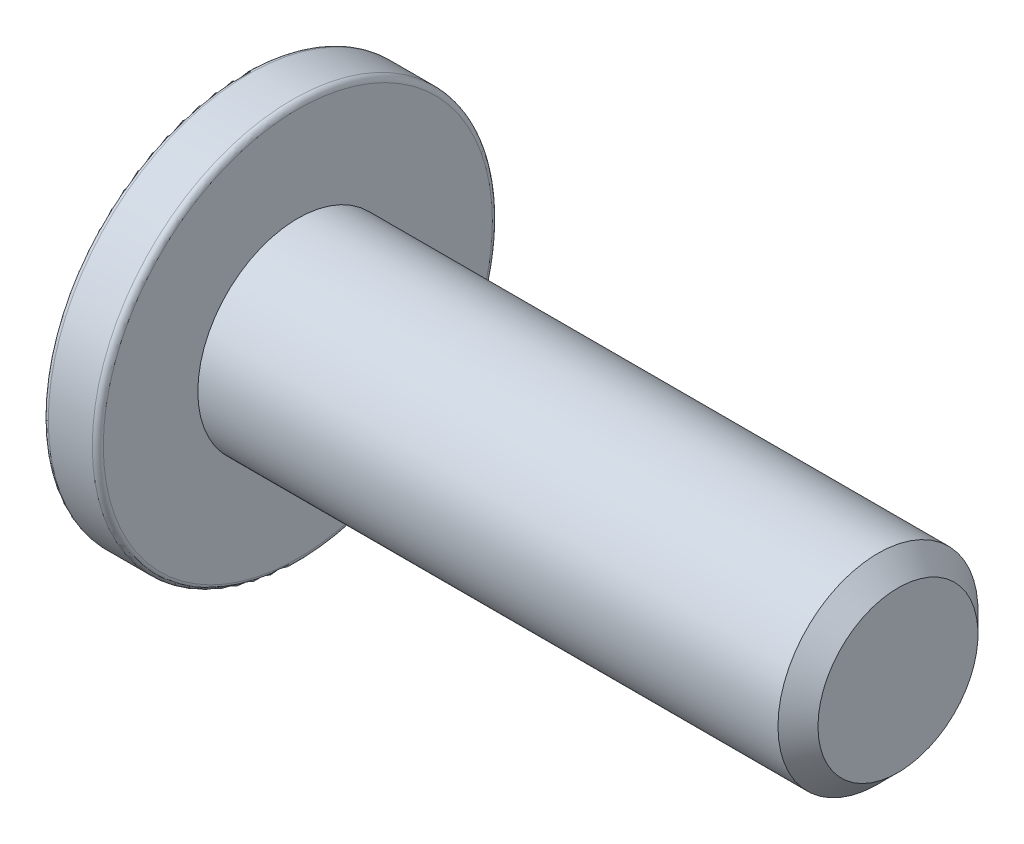
ISO-10303-21;
HEADER;
FILE_DESCRIPTION(('STEP AP214'),'2;1');
FILE_NAME('part.step','',(''),(''),'','','');
FILE_SCHEMA(('AUTOMOTIVE_DESIGN { 1 0 10303 214 1 1 1 1 }'));
ENDSEC;
DATA;
#1=APPLICATION_CONTEXT('core data for automotive mechanical design processes');
#2=APPLICATION_PROTOCOL_DEFINITION('international standard','automotive_design',2000,#1);
#3=PRODUCT_CONTEXT('',#1,'mechanical');
#4=PRODUCT('Part','Part','',(#3));
#5=PRODUCT_RELATED_PRODUCT_CATEGORY('part','',(#4));
#6=PRODUCT_DEFINITION_FORMATION('','',#4);
#7=PRODUCT_DEFINITION_CONTEXT('part definition',#1,'design');
#8=PRODUCT_DEFINITION('design','',#6,#7);
#9=PRODUCT_DEFINITION_SHAPE('','',#8);
#10=(LENGTH_UNIT() NAMED_UNIT(*) SI_UNIT(.MILLI.,.METRE.));
#11=(NAMED_UNIT(*) PLANE_ANGLE_UNIT() SI_UNIT($,.RADIAN.));
#12=(NAMED_UNIT(*) SI_UNIT($,.STERADIAN.) SOLID_ANGLE_UNIT());
#13=UNCERTAINTY_MEASURE_WITH_UNIT(LENGTH_MEASURE(1.E-05),#10,'distance_accuracy_value','');
#14=(GEOMETRIC_REPRESENTATION_CONTEXT(3) GLOBAL_UNCERTAINTY_ASSIGNED_CONTEXT((#13)) GLOBAL_UNIT_ASSIGNED_CONTEXT((#10,
#11,#12)) REPRESENTATION_CONTEXT('',''));
#15=CARTESIAN_POINT('',(0.,0.,0.));
#16=DIRECTION('',(0.,0.,1.));
#17=DIRECTION('',(1.,0.,0.));
#18=AXIS2_PLACEMENT_3D('',#15,#16,#17);
#19=CARTESIAN_POINT('',(12.,0.,0.));
#20=DIRECTION('',(-1.,0.,0.));
#21=DIRECTION('',(0.,0.,1.));
#22=AXIS2_PLACEMENT_3D('',#19,#20,#21);
#23=PLANE('',#22);
#24=CARTESIAN_POINT('',(12.,0.,0.));
#25=DIRECTION('',(-1.,0.,0.));
#26=DIRECTION('',(0.,0.,1.));
#27=AXIS2_PLACEMENT_3D('',#24,#25,#26);
#28=CIRCLE('',#27,1.6);
#29=CARTESIAN_POINT('',(12.,0.,1.6));
#30=VERTEX_POINT('',#29);
#31=EDGE_CURVE('E11',#30,#30,#28,.T.);
#32=ORIENTED_EDGE('',*,*,#31,.F.);
#33=EDGE_LOOP('',(#32));
#34=FACE_BOUND('',#33,.T.);
#35=ADVANCED_FACE('F47',(#34),#23,.F.);
#36=CARTESIAN_POINT('',(11.6,0.,0.));
#37=DIRECTION('',(-1.,0.,0.));
#38=DIRECTION('',(0.,0.,1.));
#39=AXIS2_PLACEMENT_3D('',#36,#37,#38);
#40=CONICAL_SURFACE('',#39,2.,0.785398163397453);
#41=ORIENTED_EDGE('',*,*,#31,.T.);
#42=EDGE_LOOP('',(#41));
#43=FACE_BOUND('',#42,.T.);
#44=CARTESIAN_POINT('',(11.6,0.,0.));
#45=DIRECTION('',(-1.,0.,0.));
#46=DIRECTION('',(0.,0.,1.));
#47=AXIS2_PLACEMENT_3D('',#44,#45,#46);
#48=CIRCLE('',#47,2.);
#49=CARTESIAN_POINT('',(11.6,0.,2.));
#50=VERTEX_POINT('',#49);
#51=EDGE_CURVE('E55',#50,#50,#48,.T.);
#52=ORIENTED_EDGE('',*,*,#51,.F.);
#53=EDGE_LOOP('',(#52));
#54=FACE_BOUND('',#53,.T.);
#55=ADVANCED_FACE('F196',(#43,#54),#40,.T.);
#56=CARTESIAN_POINT('',(0.,0.,0.));
#57=DIRECTION('',(-1.,0.,0.));
#58=DIRECTION('',(0.,0.,1.));
#59=AXIS2_PLACEMENT_3D('',#56,#57,#58);
#60=CYLINDRICAL_SURFACE('',#59,2.);
#61=ORIENTED_EDGE('',*,*,#51,.T.);
#62=EDGE_LOOP('',(#61));
#63=FACE_BOUND('',#62,.T.);
#64=CARTESIAN_POINT('',(0.,0.,0.));
#65=DIRECTION('',(-1.,0.,0.));
#66=DIRECTION('',(0.,0.,1.));
#67=AXIS2_PLACEMENT_3D('',#64,#65,#66);
#68=CIRCLE('',#67,2.);
#69=CARTESIAN_POINT('',(0.,0.,2.));
#70=VERTEX_POINT('',#69);
#71=EDGE_CURVE('E186',#70,#70,#68,.T.);
#72=ORIENTED_EDGE('',*,*,#71,.F.);
#73=EDGE_LOOP('',(#72));
#74=FACE_BOUND('',#73,.T.);
#75=ADVANCED_FACE('F193',(#63,#74),#60,.T.);
#76=CARTESIAN_POINT('',(0.,0.,0.));
#77=DIRECTION('',(-1.,0.,0.));
#78=DIRECTION('',(0.,0.,1.));
#79=AXIS2_PLACEMENT_3D('',#76,#77,#78);
#80=PLANE('',#79);
#81=CARTESIAN_POINT('',(0.,0.,0.));
#82=DIRECTION('',(-1.,0.,0.));
#83=DIRECTION('',(0.,0.,1.));
#84=AXIS2_PLACEMENT_3D('',#81,#82,#83);
#85=CIRCLE('',#84,3.89);
#86=CARTESIAN_POINT('',(0.,0.,3.89));
#87=VERTEX_POINT('',#86);
#88=EDGE_CURVE('E182',#87,#87,#85,.T.);
#89=ORIENTED_EDGE('',*,*,#88,.F.);
#90=EDGE_LOOP('',(#89));
#91=FACE_BOUND('',#90,.T.);
#92=ORIENTED_EDGE('',*,*,#71,.T.);
#93=EDGE_LOOP('',(#92));
#94=FACE_BOUND('',#93,.T.);
#95=ADVANCED_FACE('F202',(#91,#94),#80,.F.);
#96=CARTESIAN_POINT('',(-0.11,0.,0.));
#97=DIRECTION('',(-1.,0.,0.));
#98=DIRECTION('',(0.,0.,1.));
#99=AXIS2_PLACEMENT_3D('',#96,#97,#98);
#100=TOROIDAL_SURFACE('',#99,3.89,0.11);
#101=CARTESIAN_POINT('',(-0.11,0.,0.));
#102=DIRECTION('',(-1.,0.,0.));
#103=DIRECTION('',(0.,0.,1.));
#104=AXIS2_PLACEMENT_3D('',#101,#102,#103);
#105=CIRCLE('',#104,4.);
#106=CARTESIAN_POINT('',(-0.11,0.,4.));
#107=VERTEX_POINT('',#106);
#108=EDGE_CURVE('E178',#107,#107,#105,.T.);
#109=ORIENTED_EDGE('',*,*,#108,.F.);
#110=EDGE_LOOP('',(#109));
#111=FACE_BOUND('',#110,.T.);
#112=ORIENTED_EDGE('',*,*,#88,.T.);
#113=EDGE_LOOP('',(#112));
#114=FACE_BOUND('',#113,.T.);
#115=ADVANCED_FACE('F208',(#111,#114),#100,.T.);
#116=CARTESIAN_POINT('',(0.,0.,0.));
#117=DIRECTION('',(-1.,0.,0.));
#118=DIRECTION('',(0.,0.,1.));
#119=AXIS2_PLACEMENT_3D('',#116,#117,#118);
#120=CYLINDRICAL_SURFACE('',#119,4.);
#121=CARTESIAN_POINT('',(-0.99,0.,0.));
#122=DIRECTION('',(-1.,0.,0.));
#123=DIRECTION('',(0.,0.,1.));
#124=AXIS2_PLACEMENT_3D('',#121,#122,#123);
#125=CIRCLE('',#124,4.);
#126=CARTESIAN_POINT('',(-0.99,0.,4.));
#127=VERTEX_POINT('',#126);
#128=EDGE_CURVE('E174',#127,#127,#125,.T.);
#129=ORIENTED_EDGE('',*,*,#128,.F.);
#130=EDGE_LOOP('',(#129));
#131=FACE_BOUND('',#130,.T.);
#132=ORIENTED_EDGE('',*,*,#108,.T.);
#133=EDGE_LOOP('',(#132));
#134=FACE_BOUND('',#133,.T.);
#135=ADVANCED_FACE('F212',(#131,#134),#120,.T.);
#136=CARTESIAN_POINT('',(-0.99,0.,0.));
#137=DIRECTION('',(-1.,0.,0.));
#138=DIRECTION('',(0.,0.,1.));
#139=AXIS2_PLACEMENT_3D('',#136,#137,#138);
#140=TOROIDAL_SURFACE('',#139,3.89,0.11);
#141=CARTESIAN_POINT('',(-1.1,0.,0.));
#142=DIRECTION('',(-1.,0.,0.));
#143=DIRECTION('',(0.,0.,1.));
#144=AXIS2_PLACEMENT_3D('',#141,#142,#143);
#145=CIRCLE('',#144,3.89);
#146=CARTESIAN_POINT('',(-1.1,0.,3.89));
#147=VERTEX_POINT('',#146);
#148=EDGE_CURVE('E162',#147,#147,#145,.T.);
#149=ORIENTED_EDGE('',*,*,#148,.F.);
#150=EDGE_LOOP('',(#149));
#151=FACE_BOUND('',#150,.T.);
#152=ORIENTED_EDGE('',*,*,#128,.T.);
#153=EDGE_LOOP('',(#152));
#154=FACE_BOUND('',#153,.T.);
#155=ADVANCED_FACE('F216',(#151,#154),#140,.T.);
#156=CARTESIAN_POINT('',(-1.1,0.,0.));
#157=DIRECTION('',(-1.,0.,0.));
#158=DIRECTION('',(0.,0.,1.));
#159=AXIS2_PLACEMENT_3D('',#156,#157,#158);
#160=PLANE('',#159);
#161=DIRECTION('',(0.,0.5,0.866025403784439));
#162=VECTOR('',#161,1.);
#163=CARTESIAN_POINT('',(-1.1,-1.44337567297406,0.));
#164=LINE('',#163,#162);
#165=CARTESIAN_POINT('',(-1.1,-1.44337567297406,0.));
#166=VERTEX_POINT('',#165);
#167=CARTESIAN_POINT('',(-1.1,-0.721687836487033,1.25));
#168=VERTEX_POINT('',#167);
#169=EDGE_CURVE('E62',#166,#168,#164,.T.);
#170=ORIENTED_EDGE('',*,*,#169,.F.);
#171=DIRECTION('',(0.,-0.5,0.866025403784439));
#172=VECTOR('',#171,1.);
#173=CARTESIAN_POINT('',(-1.1,-0.721687836487032,-1.25));
#174=LINE('',#173,#172);
#175=CARTESIAN_POINT('',(-1.1,-0.721687836487032,-1.25));
#176=VERTEX_POINT('',#175);
#177=EDGE_CURVE('E156',#176,#166,#174,.T.);
#178=ORIENTED_EDGE('',*,*,#177,.F.);
#179=DIRECTION('',(0.,-1.,0.));
#180=VECTOR('',#179,1.);
#181=CARTESIAN_POINT('',(-1.1,0.721687836487032,-1.25));
#182=LINE('',#181,#180);
#183=CARTESIAN_POINT('',(-1.1,0.721687836487032,-1.25));
#184=VERTEX_POINT('',#183);
#185=EDGE_CURVE('E153',#184,#176,#182,.T.);
#186=ORIENTED_EDGE('',*,*,#185,.F.);
#187=DIRECTION('',(0.,-0.5,-0.866025403784439));
#188=VECTOR('',#187,1.);
#189=CARTESIAN_POINT('',(-1.1,1.44337567297406,0.));
#190=LINE('',#189,#188);
#191=CARTESIAN_POINT('',(-1.1,1.44337567297406,0.));
#192=VERTEX_POINT('',#191);
#193=EDGE_CURVE('E110',#192,#184,#190,.T.);
#194=ORIENTED_EDGE('',*,*,#193,.F.);
#195=DIRECTION('',(0.,0.5,-0.866025403784439));
#196=VECTOR('',#195,1.);
#197=CARTESIAN_POINT('',(-1.1,0.721687836487032,1.25));
#198=LINE('',#197,#196);
#199=CARTESIAN_POINT('',(-1.1,0.721687836487032,1.25));
#200=VERTEX_POINT('',#199);
#201=EDGE_CURVE('E147',#200,#192,#198,.T.);
#202=ORIENTED_EDGE('',*,*,#201,.F.);
#203=DIRECTION('',(0.,1.,0.));
#204=VECTOR('',#203,1.);
#205=CARTESIAN_POINT('',(-1.1,-0.721687836487033,1.25));
#206=LINE('',#205,#204);
#207=EDGE_CURVE('E143',#168,#200,#206,.T.);
#208=ORIENTED_EDGE('',*,*,#207,.F.);
#209=EDGE_LOOP('',(#170,#178,#186,#194,#202,#208));
#210=FACE_BOUND('',#209,.T.);
#211=ORIENTED_EDGE('',*,*,#148,.T.);
#212=EDGE_LOOP('',(#211));
#213=FACE_BOUND('',#212,.T.);
#214=ADVANCED_FACE('F220',(#210,#213),#160,.T.);
#215=CARTESIAN_POINT('',(-0.55,-1.44337567297406,0.));
#216=DIRECTION('',(0.,-0.866025403784439,0.5));
#217=DIRECTION('',(0.,-0.5,-0.866025403784439));
#218=AXIS2_PLACEMENT_3D('',#215,#216,#217);
#219=PLANE('',#218);
#220=ORIENTED_EDGE('',*,*,#169,.T.);
#221=DIRECTION('',(-1.,0.,0.));
#222=VECTOR('',#221,1.);
#223=CARTESIAN_POINT('',(-0.55,-0.721687836487033,1.25));
#224=LINE('',#223,#222);
#225=CARTESIAN_POINT('',(-0.55,-0.721687836487033,1.25));
#226=VERTEX_POINT('',#225);
#227=EDGE_CURVE('E92',#226,#168,#224,.T.);
#228=ORIENTED_EDGE('',*,*,#227,.F.);
#229=DIRECTION('',(0.,0.5,0.866025403784439));
#230=VECTOR('',#229,1.);
#231=CARTESIAN_POINT('',(-0.55,-1.44337567297406,0.));
#232=LINE('',#231,#230);
#233=CARTESIAN_POINT('',(-0.55,-1.44337567297406,0.));
#234=VERTEX_POINT('',#233);
#235=EDGE_CURVE('E159',#234,#226,#232,.T.);
#236=ORIENTED_EDGE('',*,*,#235,.F.);
#237=DIRECTION('',(-1.,0.,0.));
#238=VECTOR('',#237,1.);
#239=CARTESIAN_POINT('',(-0.55,-1.44337567297406,0.));
#240=LINE('',#239,#238);
#241=EDGE_CURVE('E70',#234,#166,#240,.T.);
#242=ORIENTED_EDGE('',*,*,#241,.T.);
#243=EDGE_LOOP('',(#220,#228,#236,#242));
#244=FACE_BOUND('',#243,.T.);
#245=ADVANCED_FACE('F224',(#244),#219,.F.);
#246=CARTESIAN_POINT('',(-0.55,-0.721687836487032,-1.25));
#247=DIRECTION('',(0.,-0.866025403784438,-0.5));
#248=DIRECTION('',(0.,0.5,-0.866025403784439));
#249=AXIS2_PLACEMENT_3D('',#246,#247,#248);
#250=PLANE('',#249);
#251=ORIENTED_EDGE('',*,*,#177,.T.);
#252=ORIENTED_EDGE('',*,*,#241,.F.);
#253=DIRECTION('',(0.,-0.5,0.866025403784439));
#254=VECTOR('',#253,1.);
#255=CARTESIAN_POINT('',(-0.55,-0.721687836487032,-1.25));
#256=LINE('',#255,#254);
#257=CARTESIAN_POINT('',(-0.55,-0.721687836487032,-1.25));
#258=VERTEX_POINT('',#257);
#259=EDGE_CURVE('E124',#258,#234,#256,.T.);
#260=ORIENTED_EDGE('',*,*,#259,.F.);
#261=DIRECTION('',(-1.,0.,0.));
#262=VECTOR('',#261,1.);
#263=CARTESIAN_POINT('',(-0.55,-0.721687836487032,-1.25));
#264=LINE('',#263,#262);
#265=EDGE_CURVE('E115',#258,#176,#264,.T.);
#266=ORIENTED_EDGE('',*,*,#265,.T.);
#267=EDGE_LOOP('',(#251,#252,#260,#266));
#268=FACE_BOUND('',#267,.T.);
#269=ADVANCED_FACE('F228',(#268),#250,.F.);
#270=CARTESIAN_POINT('',(-0.55,0.721687836487032,-1.25));
#271=DIRECTION('',(0.,0.,-1.));
#272=DIRECTION('',(0.,1.,0.));
#273=AXIS2_PLACEMENT_3D('',#270,#271,#272);
#274=PLANE('',#273);
#275=ORIENTED_EDGE('',*,*,#185,.T.);
#276=ORIENTED_EDGE('',*,*,#265,.F.);
#277=DIRECTION('',(0.,-1.,0.));
#278=VECTOR('',#277,1.);
#279=CARTESIAN_POINT('',(-0.55,0.721687836487032,-1.25));
#280=LINE('',#279,#278);
#281=CARTESIAN_POINT('',(-0.55,0.721687836487032,-1.25));
#282=VERTEX_POINT('',#281);
#283=EDGE_CURVE('E119',#282,#258,#280,.T.);
#284=ORIENTED_EDGE('',*,*,#283,.F.);
#285=DIRECTION('',(-1.,0.,0.));
#286=VECTOR('',#285,1.);
#287=CARTESIAN_POINT('',(-0.55,0.721687836487032,-1.25));
#288=LINE('',#287,#286);
#289=EDGE_CURVE('E103',#282,#184,#288,.T.);
#290=ORIENTED_EDGE('',*,*,#289,.T.);
#291=EDGE_LOOP('',(#275,#276,#284,#290));
#292=FACE_BOUND('',#291,.T.);
#293=ADVANCED_FACE('F120',(#292),#274,.F.);
#294=CARTESIAN_POINT('',(-0.55,1.44337567297406,0.));
#295=DIRECTION('',(0.,0.866025403784439,-0.5));
#296=DIRECTION('',(0.,0.5,0.866025403784439));
#297=AXIS2_PLACEMENT_3D('',#294,#295,#296);
#298=PLANE('',#297);
#299=ORIENTED_EDGE('',*,*,#193,.T.);
#300=ORIENTED_EDGE('',*,*,#289,.F.);
#301=DIRECTION('',(0.,-0.5,-0.866025403784439));
#302=VECTOR('',#301,1.);
#303=CARTESIAN_POINT('',(-0.55,1.44337567297406,0.));
#304=LINE('',#303,#302);
#305=CARTESIAN_POINT('',(-0.55,1.44337567297406,0.));
#306=VERTEX_POINT('',#305);
#307=EDGE_CURVE('E107',#306,#282,#304,.T.);
#308=ORIENTED_EDGE('',*,*,#307,.F.);
#309=DIRECTION('',(-1.,0.,0.));
#310=VECTOR('',#309,1.);
#311=CARTESIAN_POINT('',(-0.55,1.44337567297406,0.));
#312=LINE('',#311,#310);
#313=EDGE_CURVE('E116',#306,#192,#312,.T.);
#314=ORIENTED_EDGE('',*,*,#313,.T.);
#315=EDGE_LOOP('',(#299,#300,#308,#314));
#316=FACE_BOUND('',#315,.T.);
#317=ADVANCED_FACE('F105',(#316),#298,.F.);
#318=CARTESIAN_POINT('',(-0.55,0.721687836487032,1.25));
#319=DIRECTION('',(0.,0.866025403784439,0.5));
#320=DIRECTION('',(0.,-0.5,0.866025403784439));
#321=AXIS2_PLACEMENT_3D('',#318,#319,#320);
#322=PLANE('',#321);
#323=ORIENTED_EDGE('',*,*,#201,.T.);
#324=ORIENTED_EDGE('',*,*,#313,.F.);
#325=DIRECTION('',(0.,0.5,-0.866025403784439));
#326=VECTOR('',#325,1.);
#327=CARTESIAN_POINT('',(-0.55,0.721687836487032,1.25));
#328=LINE('',#327,#326);
#329=CARTESIAN_POINT('',(-0.55,0.721687836487032,1.25));
#330=VERTEX_POINT('',#329);
#331=EDGE_CURVE('E130',#330,#306,#328,.T.);
#332=ORIENTED_EDGE('',*,*,#331,.F.);
#333=DIRECTION('',(-1.,0.,0.));
#334=VECTOR('',#333,1.);
#335=CARTESIAN_POINT('',(-0.55,0.721687836487032,1.25));
#336=LINE('',#335,#334);
#337=EDGE_CURVE('E166',#330,#200,#336,.T.);
#338=ORIENTED_EDGE('',*,*,#337,.T.);
#339=EDGE_LOOP('',(#323,#324,#332,#338));
#340=FACE_BOUND('',#339,.T.);
#341=ADVANCED_FACE('F232',(#340),#322,.F.);
#342=CARTESIAN_POINT('',(-0.55,-0.721687836487033,1.25));
#343=DIRECTION('',(0.,0.,1.));
#344=DIRECTION('',(0.,-1.,0.));
#345=AXIS2_PLACEMENT_3D('',#342,#343,#344);
#346=PLANE('',#345);
#347=ORIENTED_EDGE('',*,*,#207,.T.);
#348=ORIENTED_EDGE('',*,*,#337,.F.);
#349=DIRECTION('',(0.,1.,0.));
#350=VECTOR('',#349,1.);
#351=CARTESIAN_POINT('',(-0.55,-0.721687836487033,1.25));
#352=LINE('',#351,#350);
#353=EDGE_CURVE('E135',#226,#330,#352,.T.);
#354=ORIENTED_EDGE('',*,*,#353,.F.);
#355=ORIENTED_EDGE('',*,*,#227,.T.);
#356=EDGE_LOOP('',(#347,#348,#354,#355));
#357=FACE_BOUND('',#356,.T.);
#358=ADVANCED_FACE('F229',(#357),#346,.F.);
#359=CARTESIAN_POINT('',(-0.55,0.,0.));
#360=DIRECTION('',(-1.,0.,0.));
#361=DIRECTION('',(0.,0.,1.));
#362=AXIS2_PLACEMENT_3D('',#359,#360,#361);
#363=PLANE('',#362);
#364=ORIENTED_EDGE('',*,*,#235,.T.);
#365=ORIENTED_EDGE('',*,*,#353,.T.);
#366=ORIENTED_EDGE('',*,*,#331,.T.);
#367=ORIENTED_EDGE('',*,*,#307,.T.);
#368=ORIENTED_EDGE('',*,*,#283,.T.);
#369=ORIENTED_EDGE('',*,*,#259,.T.);
#370=EDGE_LOOP('',(#364,#365,#366,#367,#368,#369));
#371=FACE_BOUND('',#370,.T.);
#372=ADVANCED_FACE('F127',(#371),#363,.T.);
#373=CLOSED_SHELL('',(#35,#55,#75,#95,#115,#135,#155,#214,#245,#269,#293,#317,#341,#358,#372));
#374=MANIFOLD_SOLID_BREP('B2',#373);
#375=ADVANCED_BREP_SHAPE_REPRESENTATION('',(#18,#374),#14);
#376=SHAPE_DEFINITION_REPRESENTATION(#9,#375);
ENDSEC;
END-ISO-10303-21;
